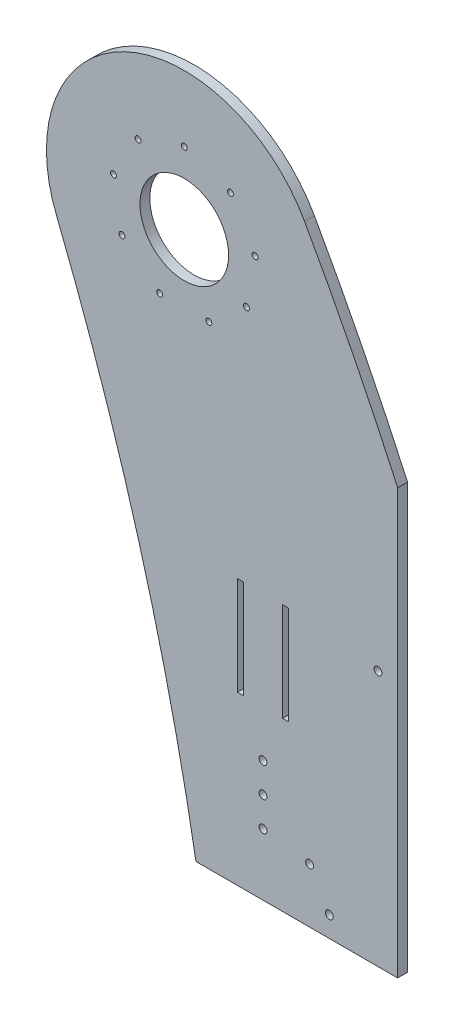
ISO-10303-21;
HEADER;
FILE_DESCRIPTION(('STEP AP214'),'2;1');
FILE_NAME('part.step','',(''),(''),'','','');
FILE_SCHEMA(('AUTOMOTIVE_DESIGN { 1 0 10303 214 1 1 1 1 }'));
ENDSEC;
DATA;
#1=APPLICATION_CONTEXT('core data for automotive mechanical design processes');
#2=APPLICATION_PROTOCOL_DEFINITION('international standard','automotive_design',2000,#1);
#3=PRODUCT_CONTEXT('',#1,'mechanical');
#4=PRODUCT('Part','Part','',(#3));
#5=PRODUCT_RELATED_PRODUCT_CATEGORY('part','',(#4));
#6=PRODUCT_DEFINITION_FORMATION('','',#4);
#7=PRODUCT_DEFINITION_CONTEXT('part definition',#1,'design');
#8=PRODUCT_DEFINITION('design','',#6,#7);
#9=PRODUCT_DEFINITION_SHAPE('','',#8);
#10=(LENGTH_UNIT() NAMED_UNIT(*) SI_UNIT(.MILLI.,.METRE.));
#11=(NAMED_UNIT(*) PLANE_ANGLE_UNIT() SI_UNIT($,.RADIAN.));
#12=(NAMED_UNIT(*) SI_UNIT($,.STERADIAN.) SOLID_ANGLE_UNIT());
#13=UNCERTAINTY_MEASURE_WITH_UNIT(LENGTH_MEASURE(1.E-05),#10,'distance_accuracy_value','');
#14=(GEOMETRIC_REPRESENTATION_CONTEXT(3) GLOBAL_UNCERTAINTY_ASSIGNED_CONTEXT((#13)) GLOBAL_UNIT_ASSIGNED_CONTEXT((#10,
#11,#12)) REPRESENTATION_CONTEXT('',''));
#15=CARTESIAN_POINT('',(0.,0.,0.));
#16=DIRECTION('',(0.,0.,1.));
#17=DIRECTION('',(1.,0.,0.));
#18=AXIS2_PLACEMENT_3D('',#15,#16,#17);
#19=CARTESIAN_POINT('',(0.,325.,0.));
#20=DIRECTION('',(0.,-1.,0.));
#21=DIRECTION('',(0.,0.,-1.));
#22=AXIS2_PLACEMENT_3D('',#19,#20,#21);
#23=PLANE('',#22);
#24=DIRECTION('',(0.,0.,1.));
#25=VECTOR('',#24,1.);
#26=CARTESIAN_POINT('',(-11.5956875587686,324.999999999994,-5.));
#27=LINE('',#26,#25);
#28=CARTESIAN_POINT('',(-11.5956875587686,325.,0.));
#29=VERTEX_POINT('',#28);
#30=CARTESIAN_POINT('',(-11.5956875587686,324.999999999994,5.));
#31=VERTEX_POINT('',#30);
#32=EDGE_CURVE('E55',#29,#31,#27,.T.);
#33=ORIENTED_EDGE('',*,*,#32,.T.);
#34=DIRECTION('',(1.,0.,0.));
#35=VECTOR('',#34,1.);
#36=CARTESIAN_POINT('',(0.,325.,5.));
#37=LINE('',#36,#35);
#38=CARTESIAN_POINT('',(-114.06644065351,325.,5.));
#39=VERTEX_POINT('',#38);
#40=EDGE_CURVE('E278',#39,#31,#37,.T.);
#41=ORIENTED_EDGE('',*,*,#40,.F.);
#42=DIRECTION('',(0.,0.,-1.));
#43=VECTOR('',#42,1.);
#44=CARTESIAN_POINT('',(-114.06644065351,325.,5.));
#45=LINE('',#44,#43);
#46=CARTESIAN_POINT('',(-114.06644065351,325.,0.));
#47=VERTEX_POINT('',#46);
#48=EDGE_CURVE('E282',#47,#39,#45,.F.);
#49=ORIENTED_EDGE('',*,*,#48,.F.);
#50=DIRECTION('',(1.,0.,0.));
#51=VECTOR('',#50,1.);
#52=CARTESIAN_POINT('',(0.,325.,0.));
#53=LINE('',#52,#51);
#54=EDGE_CURVE('E285',#47,#29,#53,.T.);
#55=ORIENTED_EDGE('',*,*,#54,.T.);
#56=EDGE_LOOP('',(#33,#41,#49,#55));
#57=FACE_BOUND('',#56,.T.);
#58=ADVANCED_FACE('F40',(#57),#23,.T.);
#59=CARTESIAN_POINT('',(-1345.24654178278,108.90844860724,5.));
#60=DIRECTION('',(0.,0.,-1.));
#61=DIRECTION('',(-1.,0.,0.));
#62=AXIS2_PLACEMENT_3D('',#59,#60,#61);
#63=CYLINDRICAL_SURFACE('',#62,1250.);
#64=CARTESIAN_POINT('',(-1345.24654178278,108.90844860724,0.));
#65=DIRECTION('',(0.,0.,1.));
#66=DIRECTION('',(1.,0.,0.));
#67=AXIS2_PLACEMENT_3D('',#64,#65,#66);
#68=CIRCLE('',#67,1250.);
#69=CARTESIAN_POINT('',(-184.975195397572,573.95726621402,0.));
#70=VERTEX_POINT('',#69);
#71=EDGE_CURVE('E225',#47,#70,#68,.T.);
#72=ORIENTED_EDGE('',*,*,#71,.F.);
#73=ORIENTED_EDGE('',*,*,#48,.T.);
#74=CARTESIAN_POINT('',(-1345.24654178278,108.90844860724,5.));
#75=DIRECTION('',(0.,0.,1.));
#76=DIRECTION('',(1.,0.,0.));
#77=AXIS2_PLACEMENT_3D('',#74,#75,#76);
#78=CIRCLE('',#77,1250.);
#79=CARTESIAN_POINT('',(-184.975195397572,573.95726621402,5.));
#80=VERTEX_POINT('',#79);
#81=EDGE_CURVE('E290',#39,#80,#78,.T.);
#82=ORIENTED_EDGE('',*,*,#81,.T.);
#83=DIRECTION('',(0.,0.,-1.));
#84=VECTOR('',#83,1.);
#85=CARTESIAN_POINT('',(-184.975195397572,573.95726621402,5.));
#86=LINE('',#85,#84);
#87=EDGE_CURVE('E172',#80,#70,#86,.T.);
#88=ORIENTED_EDGE('',*,*,#87,.T.);
#89=EDGE_LOOP('',(#72,#73,#82,#88));
#90=FACE_BOUND('',#89,.T.);
#91=ADVANCED_FACE('F397',(#90),#63,.F.);
#92=CARTESIAN_POINT('',(-1149.77276852362,23.8333182080057,5.));
#93=DIRECTION('',(0.,0.,-1.));
#94=DIRECTION('',(-1.,0.,0.));
#95=AXIS2_PLACEMENT_3D('',#92,#93,#94);
#96=CYLINDRICAL_SURFACE('',#95,1250.);
#97=CARTESIAN_POINT('',(-1149.77276852362,23.8333182080057,5.));
#98=DIRECTION('',(0.,0.,1.));
#99=DIRECTION('',(1.,0.,0.));
#100=AXIS2_PLACEMENT_3D('',#97,#98,#99);
#101=CIRCLE('',#100,1250.);
#102=CARTESIAN_POINT('',(-11.5956875587686,540.60496252136,5.));
#103=VERTEX_POINT('',#102);
#104=CARTESIAN_POINT('',(-58.9117849180903,634.179379428339,5.));
#105=VERTEX_POINT('',#104);
#106=EDGE_CURVE('E104',#103,#105,#101,.T.);
#107=ORIENTED_EDGE('',*,*,#106,.F.);
#108=DIRECTION('',(0.,0.,1.));
#109=VECTOR('',#108,1.);
#110=CARTESIAN_POINT('',(-11.5956875587686,540.60496252136,-5.));
#111=LINE('',#110,#109);
#112=CARTESIAN_POINT('',(-11.5956875587686,540.60496252136,0.));
#113=VERTEX_POINT('',#112);
#114=EDGE_CURVE('E297',#113,#103,#111,.T.);
#115=ORIENTED_EDGE('',*,*,#114,.F.);
#116=CARTESIAN_POINT('',(-1149.77276852362,23.8333182080057,0.));
#117=DIRECTION('',(0.,0.,1.));
#118=DIRECTION('',(1.,0.,0.));
#119=AXIS2_PLACEMENT_3D('',#116,#117,#118);
#120=CIRCLE('',#119,1250.);
#121=CARTESIAN_POINT('',(-58.9117849180903,634.179379428339,0.));
#122=VERTEX_POINT('',#121);
#123=EDGE_CURVE('E63',#113,#122,#120,.T.);
#124=ORIENTED_EDGE('',*,*,#123,.T.);
#125=DIRECTION('',(0.,0.,-1.));
#126=VECTOR('',#125,1.);
#127=CARTESIAN_POINT('',(-58.9117849180903,634.179379428339,5.));
#128=LINE('',#127,#126);
#129=EDGE_CURVE('E310',#105,#122,#128,.T.);
#130=ORIENTED_EDGE('',*,*,#129,.F.);
#131=EDGE_LOOP('',(#107,#115,#124,#130));
#132=FACE_BOUND('',#131,.T.);
#133=ADVANCED_FACE('F349',(#132),#96,.T.);
#134=CARTESIAN_POINT('',(0.,0.,5.));
#135=DIRECTION('',(0.,0.,1.));
#136=DIRECTION('',(1.,0.,0.));
#137=AXIS2_PLACEMENT_3D('',#134,#135,#136);
#138=PLANE('',#137);
#139=DIRECTION('',(0.,-1.,0.));
#140=VECTOR('',#139,1.);
#141=CARTESIAN_POINT('',(-11.5956875587686,324.999999999994,5.));
#142=LINE('',#141,#140);
#143=EDGE_CURVE('E303',#103,#31,#142,.T.);
#144=ORIENTED_EDGE('',*,*,#143,.F.);
#145=ORIENTED_EDGE('',*,*,#106,.T.);
#146=CARTESIAN_POINT('',(-120.,600.,5.));
#147=DIRECTION('',(0.,0.,1.));
#148=DIRECTION('',(1.,0.,0.));
#149=AXIS2_PLACEMENT_3D('',#146,#147,#148);
#150=CIRCLE('',#149,70.);
#151=EDGE_CURVE('E192',#105,#80,#150,.T.);
#152=ORIENTED_EDGE('',*,*,#151,.T.);
#153=ORIENTED_EDGE('',*,*,#81,.F.);
#154=ORIENTED_EDGE('',*,*,#40,.T.);
#155=EDGE_LOOP('',(#144,#145,#152,#153,#154));
#156=FACE_BOUND('',#155,.T.);
#157=CARTESIAN_POINT('',(-21.5956875587686,455.,5.));
#158=DIRECTION('',(0.,0.,1.));
#159=DIRECTION('',(1.,0.,0.));
#160=AXIS2_PLACEMENT_3D('',#157,#158,#159);
#161=CIRCLE('',#160,2.);
#162=CARTESIAN_POINT('',(-19.5956875587686,455.,5.));
#163=VERTEX_POINT('',#162);
#164=EDGE_CURVE('E307',#163,#163,#161,.T.);
#165=ORIENTED_EDGE('',*,*,#164,.F.);
#166=EDGE_LOOP('',(#165));
#167=FACE_BOUND('',#166,.T.);
#168=CARTESIAN_POINT('',(-120.,600.,5.));
#169=DIRECTION('',(0.,0.,1.));
#170=DIRECTION('',(1.,0.,0.));
#171=AXIS2_PLACEMENT_3D('',#168,#169,#170);
#172=CIRCLE('',#171,22.5);
#173=CARTESIAN_POINT('',(-97.5,600.,5.));
#174=VERTEX_POINT('',#173);
#175=EDGE_CURVE('E168',#174,#174,#172,.T.);
#176=ORIENTED_EDGE('',*,*,#175,.F.);
#177=EDGE_LOOP('',(#176));
#178=FACE_BOUND('',#177,.T.);
#179=DIRECTION('',(1.,0.,0.));
#180=VECTOR('',#179,1.);
#181=CARTESIAN_POINT('',(0.,460.,5.));
#182=LINE('',#181,#180);
#183=CARTESIAN_POINT('',(-70.0000000000001,460.,5.));
#184=VERTEX_POINT('',#183);
#185=CARTESIAN_POINT('',(-67.0000000000001,460.,5.));
#186=VERTEX_POINT('',#185);
#187=EDGE_CURVE('E180',#184,#186,#182,.T.);
#188=ORIENTED_EDGE('',*,*,#187,.T.);
#189=DIRECTION('',(0.,-1.,0.));
#190=VECTOR('',#189,1.);
#191=CARTESIAN_POINT('',(-67.0000000000001,0.,5.));
#192=LINE('',#191,#190);
#193=CARTESIAN_POINT('',(-67.0000000000001,410.,5.));
#194=VERTEX_POINT('',#193);
#195=EDGE_CURVE('E178',#186,#194,#192,.T.);
#196=ORIENTED_EDGE('',*,*,#195,.T.);
#197=DIRECTION('',(1.,0.,0.));
#198=VECTOR('',#197,1.);
#199=CARTESIAN_POINT('',(0.,410.,5.));
#200=LINE('',#199,#198);
#201=CARTESIAN_POINT('',(-70.0000000000001,410.,5.));
#202=VERTEX_POINT('',#201);
#203=EDGE_CURVE('E175',#202,#194,#200,.T.);
#204=ORIENTED_EDGE('',*,*,#203,.F.);
#205=DIRECTION('',(0.,-1.,0.));
#206=VECTOR('',#205,1.);
#207=CARTESIAN_POINT('',(-70.0000000000001,0.,5.));
#208=LINE('',#207,#206);
#209=EDGE_CURVE('E171',#184,#202,#208,.T.);
#210=ORIENTED_EDGE('',*,*,#209,.F.);
#211=EDGE_LOOP('',(#188,#196,#204,#210));
#212=FACE_BOUND('',#211,.T.);
#213=DIRECTION('',(1.,0.,0.));
#214=VECTOR('',#213,1.);
#215=CARTESIAN_POINT('',(0.,460.,5.));
#216=LINE('',#215,#214);
#217=CARTESIAN_POINT('',(-93.0000000000001,460.,5.));
#218=VERTEX_POINT('',#217);
#219=CARTESIAN_POINT('',(-90.0000000000001,460.,5.));
#220=VERTEX_POINT('',#219);
#221=EDGE_CURVE('E190',#218,#220,#216,.T.);
#222=ORIENTED_EDGE('',*,*,#221,.T.);
#223=DIRECTION('',(0.,-1.,0.));
#224=VECTOR('',#223,1.);
#225=CARTESIAN_POINT('',(-90.0000000000001,0.,5.));
#226=LINE('',#225,#224);
#227=CARTESIAN_POINT('',(-90.0000000000001,410.,5.));
#228=VERTEX_POINT('',#227);
#229=EDGE_CURVE('E154',#220,#228,#226,.T.);
#230=ORIENTED_EDGE('',*,*,#229,.T.);
#231=DIRECTION('',(1.,0.,0.));
#232=VECTOR('',#231,1.);
#233=CARTESIAN_POINT('',(0.,410.,5.));
#234=LINE('',#233,#232);
#235=CARTESIAN_POINT('',(-93.0000000000001,410.,5.));
#236=VERTEX_POINT('',#235);
#237=EDGE_CURVE('E186',#236,#228,#234,.T.);
#238=ORIENTED_EDGE('',*,*,#237,.F.);
#239=DIRECTION('',(0.,-1.,0.));
#240=VECTOR('',#239,1.);
#241=CARTESIAN_POINT('',(-93.0000000000001,0.,5.));
#242=LINE('',#241,#240);
#243=EDGE_CURVE('E183',#218,#236,#242,.T.);
#244=ORIENTED_EDGE('',*,*,#243,.F.);
#245=EDGE_LOOP('',(#222,#230,#238,#244));
#246=FACE_BOUND('',#245,.T.);
#247=CARTESIAN_POINT('',(-80.,371.410161513777,5.));
#248=DIRECTION('',(0.,0.,-1.));
#249=DIRECTION('',(-1.,0.,0.));
#250=AXIS2_PLACEMENT_3D('',#247,#248,#249);
#251=CIRCLE('',#250,2.);
#252=CARTESIAN_POINT('',(-82.,371.410161513777,5.));
#253=VERTEX_POINT('',#252);
#254=EDGE_CURVE('E213',#253,#253,#251,.T.);
#255=ORIENTED_EDGE('',*,*,#254,.T.);
#256=EDGE_LOOP('',(#255));
#257=FACE_BOUND('',#256,.T.);
#258=CARTESIAN_POINT('',(-80.0000000000001,356.410161513777,5.));
#259=DIRECTION('',(0.,0.,-1.));
#260=DIRECTION('',(-1.,0.,0.));
#261=AXIS2_PLACEMENT_3D('',#258,#259,#260);
#262=CIRCLE('',#261,2.);
#263=CARTESIAN_POINT('',(-82.0000000000001,356.410161513777,5.));
#264=VERTEX_POINT('',#263);
#265=EDGE_CURVE('E207',#264,#264,#262,.T.);
#266=ORIENTED_EDGE('',*,*,#265,.T.);
#267=EDGE_LOOP('',(#266));
#268=FACE_BOUND('',#267,.T.);
#269=CARTESIAN_POINT('',(-56.3397459621557,352.749907475932,5.));
#270=DIRECTION('',(0.,0.,-1.));
#271=DIRECTION('',(-1.,0.,0.));
#272=AXIS2_PLACEMENT_3D('',#269,#270,#271);
#273=CIRCLE('',#272,1.99999999999999);
#274=CARTESIAN_POINT('',(-58.3397459621557,352.749907475932,5.));
#275=VERTEX_POINT('',#274);
#276=EDGE_CURVE('E201',#275,#275,#273,.T.);
#277=ORIENTED_EDGE('',*,*,#276,.T.);
#278=EDGE_LOOP('',(#277));
#279=FACE_BOUND('',#278,.T.);
#280=CARTESIAN_POINT('',(-46.3397459621558,335.429399400244,5.));
#281=DIRECTION('',(0.,0.,-1.));
#282=DIRECTION('',(-1.,0.,0.));
#283=AXIS2_PLACEMENT_3D('',#280,#281,#282);
#284=CIRCLE('',#283,2.);
#285=CARTESIAN_POINT('',(-48.3397459621558,335.429399400244,5.));
#286=VERTEX_POINT('',#285);
#287=EDGE_CURVE('E194',#286,#286,#284,.T.);
#288=ORIENTED_EDGE('',*,*,#287,.T.);
#289=EDGE_LOOP('',(#288));
#290=FACE_BOUND('',#289,.T.);
#291=CARTESIAN_POINT('',(-79.9999999999999,386.410161513777,5.));
#292=DIRECTION('',(0.,0.,-1.));
#293=DIRECTION('',(-1.,0.,0.));
#294=AXIS2_PLACEMENT_3D('',#291,#292,#293);
#295=CIRCLE('',#294,2.);
#296=CARTESIAN_POINT('',(-81.9999999999999,386.410161513777,5.));
#297=VERTEX_POINT('',#296);
#298=EDGE_CURVE('E222',#297,#297,#295,.T.);
#299=ORIENTED_EDGE('',*,*,#298,.T.);
#300=EDGE_LOOP('',(#299));
#301=FACE_BOUND('',#300,.T.);
#302=CARTESIAN_POINT('',(-143.461747753559,627.960622173843,5.));
#303=DIRECTION('',(0.,0.,1.));
#304=DIRECTION('',(1.,0.,0.));
#305=AXIS2_PLACEMENT_3D('',#302,#303,#304);
#306=CIRCLE('',#305,1.50000000000005);
#307=CARTESIAN_POINT('',(-141.961747753559,627.960622173843,5.));
#308=VERTEX_POINT('',#307);
#309=EDGE_CURVE('E228',#308,#308,#306,.T.);
#310=ORIENTED_EDGE('',*,*,#309,.F.);
#311=EDGE_LOOP('',(#310));
#312=FACE_BOUND('',#311,.T.);
#313=CARTESIAN_POINT('',(-155.945482984946,606.338158484843,5.));
#314=DIRECTION('',(0.,0.,1.));
#315=DIRECTION('',(1.,0.,0.));
#316=AXIS2_PLACEMENT_3D('',#313,#314,#315);
#317=CIRCLE('',#316,1.50000000000002);
#318=CARTESIAN_POINT('',(-154.445482984946,606.338158484843,5.));
#319=VERTEX_POINT('',#318);
#320=EDGE_CURVE('E234',#319,#319,#317,.T.);
#321=ORIENTED_EDGE('',*,*,#320,.F.);
#322=EDGE_LOOP('',(#321));
#323=FACE_BOUND('',#322,.T.);
#324=CARTESIAN_POINT('',(-151.609927238132,581.75,5.));
#325=DIRECTION('',(0.,0.,1.));
#326=DIRECTION('',(1.,0.,0.));
#327=AXIS2_PLACEMENT_3D('',#324,#325,#326);
#328=CIRCLE('',#327,1.5000000000001);
#329=CARTESIAN_POINT('',(-150.109927238132,581.75,5.));
#330=VERTEX_POINT('',#329);
#331=EDGE_CURVE('E240',#330,#330,#328,.T.);
#332=ORIENTED_EDGE('',*,*,#331,.F.);
#333=EDGE_LOOP('',(#332));
#334=FACE_BOUND('',#333,.T.);
#335=CARTESIAN_POINT('',(-132.483735231387,565.701219341314,5.));
#336=DIRECTION('',(0.,0.,1.));
#337=DIRECTION('',(1.,0.,0.));
#338=AXIS2_PLACEMENT_3D('',#335,#336,#337);
#339=CIRCLE('',#338,1.5000000000001);
#340=CARTESIAN_POINT('',(-130.983735231387,565.701219341314,5.));
#341=VERTEX_POINT('',#340);
#342=EDGE_CURVE('E246',#341,#341,#339,.T.);
#343=ORIENTED_EDGE('',*,*,#342,.F.);
#344=EDGE_LOOP('',(#343));
#345=FACE_BOUND('',#344,.T.);
#346=CARTESIAN_POINT('',(-107.516264768613,565.701219341314,5.));
#347=DIRECTION('',(0.,0.,1.));
#348=DIRECTION('',(1.,0.,0.));
#349=AXIS2_PLACEMENT_3D('',#346,#347,#348);
#350=CIRCLE('',#349,1.50000000000006);
#351=CARTESIAN_POINT('',(-106.016264768613,565.701219341314,5.));
#352=VERTEX_POINT('',#351);
#353=EDGE_CURVE('E252',#352,#352,#350,.T.);
#354=ORIENTED_EDGE('',*,*,#353,.F.);
#355=EDGE_LOOP('',(#354));
#356=FACE_BOUND('',#355,.T.);
#357=CARTESIAN_POINT('',(-88.3900727618681,581.75,5.));
#358=DIRECTION('',(0.,0.,1.));
#359=DIRECTION('',(1.,0.,0.));
#360=AXIS2_PLACEMENT_3D('',#357,#358,#359);
#361=CIRCLE('',#360,1.49999999999997);
#362=CARTESIAN_POINT('',(-86.8900727618681,581.75,5.));
#363=VERTEX_POINT('',#362);
#364=EDGE_CURVE('E258',#363,#363,#361,.T.);
#365=ORIENTED_EDGE('',*,*,#364,.F.);
#366=EDGE_LOOP('',(#365));
#367=FACE_BOUND('',#366,.T.);
#368=CARTESIAN_POINT('',(-84.0545170150545,606.338158484843,5.));
#369=DIRECTION('',(0.,0.,1.));
#370=DIRECTION('',(1.,0.,0.));
#371=AXIS2_PLACEMENT_3D('',#368,#369,#370);
#372=CIRCLE('',#371,1.49999999999996);
#373=CARTESIAN_POINT('',(-82.5545170150545,606.338158484843,5.));
#374=VERTEX_POINT('',#373);
#375=EDGE_CURVE('E264',#374,#374,#372,.T.);
#376=ORIENTED_EDGE('',*,*,#375,.F.);
#377=EDGE_LOOP('',(#376));
#378=FACE_BOUND('',#377,.T.);
#379=CARTESIAN_POINT('',(-96.5382522464414,627.960622173843,5.));
#380=DIRECTION('',(0.,0.,1.));
#381=DIRECTION('',(1.,0.,0.));
#382=AXIS2_PLACEMENT_3D('',#379,#380,#381);
#383=CIRCLE('',#382,1.5);
#384=CARTESIAN_POINT('',(-95.0382522464414,627.960622173843,5.));
#385=VERTEX_POINT('',#384);
#386=EDGE_CURVE('E270',#385,#385,#383,.T.);
#387=ORIENTED_EDGE('',*,*,#386,.F.);
#388=EDGE_LOOP('',(#387));
#389=FACE_BOUND('',#388,.T.);
#390=CARTESIAN_POINT('',(-120.,636.5,5.));
#391=DIRECTION('',(0.,0.,1.));
#392=DIRECTION('',(1.,0.,0.));
#393=AXIS2_PLACEMENT_3D('',#390,#391,#392);
#394=CIRCLE('',#393,1.50000000000005);
#395=CARTESIAN_POINT('',(-118.5,636.5,5.));
#396=VERTEX_POINT('',#395);
#397=EDGE_CURVE('E273',#396,#396,#394,.T.);
#398=ORIENTED_EDGE('',*,*,#397,.F.);
#399=EDGE_LOOP('',(#398));
#400=FACE_BOUND('',#399,.T.);
#401=ADVANCED_FACE('F42',(#156,#167,#178,#212,#246,#257,#268,#279,#290,#301,#312,#323,#334,#345,
#356,#367,#378,#389,#400),#138,.T.);
#402=CARTESIAN_POINT('',(0.,0.,0.));
#403=DIRECTION('',(0.,0.,1.));
#404=DIRECTION('',(1.,0.,0.));
#405=AXIS2_PLACEMENT_3D('',#402,#403,#404);
#406=PLANE('',#405);
#407=CARTESIAN_POINT('',(-21.5956875587686,455.,0.));
#408=DIRECTION('',(0.,0.,1.));
#409=DIRECTION('',(1.,0.,0.));
#410=AXIS2_PLACEMENT_3D('',#407,#408,#409);
#411=CIRCLE('',#410,2.);
#412=CARTESIAN_POINT('',(-19.5956875587686,455.,0.));
#413=VERTEX_POINT('',#412);
#414=EDGE_CURVE('E288',#413,#413,#411,.T.);
#415=ORIENTED_EDGE('',*,*,#414,.T.);
#416=EDGE_LOOP('',(#415));
#417=FACE_BOUND('',#416,.T.);
#418=CARTESIAN_POINT('',(-120.,600.,0.));
#419=DIRECTION('',(0.,0.,1.));
#420=DIRECTION('',(1.,0.,0.));
#421=AXIS2_PLACEMENT_3D('',#418,#419,#420);
#422=CIRCLE('',#421,22.5);
#423=CARTESIAN_POINT('',(-97.5,600.,0.));
#424=VERTEX_POINT('',#423);
#425=EDGE_CURVE('E292',#424,#424,#422,.T.);
#426=ORIENTED_EDGE('',*,*,#425,.T.);
#427=EDGE_LOOP('',(#426));
#428=FACE_BOUND('',#427,.T.);
#429=DIRECTION('',(1.,0.,0.));
#430=VECTOR('',#429,1.);
#431=CARTESIAN_POINT('',(0.,460.,0.));
#432=LINE('',#431,#430);
#433=CARTESIAN_POINT('',(-70.0000000000001,460.,0.));
#434=VERTEX_POINT('',#433);
#435=CARTESIAN_POINT('',(-67.0000000000001,460.,0.));
#436=VERTEX_POINT('',#435);
#437=EDGE_CURVE('E337',#434,#436,#432,.T.);
#438=ORIENTED_EDGE('',*,*,#437,.F.);
#439=DIRECTION('',(0.,-1.,0.));
#440=VECTOR('',#439,1.);
#441=CARTESIAN_POINT('',(-70.0000000000001,0.,0.));
#442=LINE('',#441,#440);
#443=CARTESIAN_POINT('',(-70.0000000000001,410.,0.));
#444=VERTEX_POINT('',#443);
#445=EDGE_CURVE('E328',#434,#444,#442,.T.);
#446=ORIENTED_EDGE('',*,*,#445,.T.);
#447=DIRECTION('',(1.,0.,0.));
#448=VECTOR('',#447,1.);
#449=CARTESIAN_POINT('',(0.,410.,0.));
#450=LINE('',#449,#448);
#451=CARTESIAN_POINT('',(-67.0000000000001,410.,0.));
#452=VERTEX_POINT('',#451);
#453=EDGE_CURVE('E331',#444,#452,#450,.T.);
#454=ORIENTED_EDGE('',*,*,#453,.T.);
#455=DIRECTION('',(0.,-1.,0.));
#456=VECTOR('',#455,1.);
#457=CARTESIAN_POINT('',(-67.0000000000001,0.,0.));
#458=LINE('',#457,#456);
#459=EDGE_CURVE('E334',#436,#452,#458,.T.);
#460=ORIENTED_EDGE('',*,*,#459,.F.);
#461=EDGE_LOOP('',(#438,#446,#454,#460));
#462=FACE_BOUND('',#461,.T.);
#463=DIRECTION('',(1.,0.,0.));
#464=VECTOR('',#463,1.);
#465=CARTESIAN_POINT('',(0.,460.,0.));
#466=LINE('',#465,#464);
#467=CARTESIAN_POINT('',(-93.0000000000001,460.,0.));
#468=VERTEX_POINT('',#467);
#469=CARTESIAN_POINT('',(-90.0000000000001,460.,0.));
#470=VERTEX_POINT('',#469);
#471=EDGE_CURVE('E144',#468,#470,#466,.T.);
#472=ORIENTED_EDGE('',*,*,#471,.F.);
#473=DIRECTION('',(0.,-1.,0.));
#474=VECTOR('',#473,1.);
#475=CARTESIAN_POINT('',(-93.0000000000001,0.,0.));
#476=LINE('',#475,#474);
#477=CARTESIAN_POINT('',(-93.0000000000001,410.,0.));
#478=VERTEX_POINT('',#477);
#479=EDGE_CURVE('E339',#468,#478,#476,.T.);
#480=ORIENTED_EDGE('',*,*,#479,.T.);
#481=DIRECTION('',(1.,0.,0.));
#482=VECTOR('',#481,1.);
#483=CARTESIAN_POINT('',(0.,410.,0.));
#484=LINE('',#483,#482);
#485=CARTESIAN_POINT('',(-90.0000000000001,410.,0.));
#486=VERTEX_POINT('',#485);
#487=EDGE_CURVE('E147',#478,#486,#484,.T.);
#488=ORIENTED_EDGE('',*,*,#487,.T.);
#489=DIRECTION('',(0.,-1.,0.));
#490=VECTOR('',#489,1.);
#491=CARTESIAN_POINT('',(-90.0000000000001,0.,0.));
#492=LINE('',#491,#490);
#493=EDGE_CURVE('E138',#470,#486,#492,.T.);
#494=ORIENTED_EDGE('',*,*,#493,.F.);
#495=EDGE_LOOP('',(#472,#480,#488,#494));
#496=FACE_BOUND('',#495,.T.);
#497=CARTESIAN_POINT('',(-80.,371.410161513777,0.));
#498=DIRECTION('',(0.,0.,-1.));
#499=DIRECTION('',(-1.,0.,0.));
#500=AXIS2_PLACEMENT_3D('',#497,#498,#499);
#501=CIRCLE('',#500,2.);
#502=CARTESIAN_POINT('',(-82.,371.410161513777,0.));
#503=VERTEX_POINT('',#502);
#504=EDGE_CURVE('E216',#503,#503,#501,.T.);
#505=ORIENTED_EDGE('',*,*,#504,.F.);
#506=EDGE_LOOP('',(#505));
#507=FACE_BOUND('',#506,.T.);
#508=CARTESIAN_POINT('',(-80.0000000000001,356.410161513777,0.));
#509=DIRECTION('',(0.,0.,-1.));
#510=DIRECTION('',(-1.,0.,0.));
#511=AXIS2_PLACEMENT_3D('',#508,#509,#510);
#512=CIRCLE('',#511,2.);
#513=CARTESIAN_POINT('',(-82.0000000000001,356.410161513777,0.));
#514=VERTEX_POINT('',#513);
#515=EDGE_CURVE('E210',#514,#514,#512,.T.);
#516=ORIENTED_EDGE('',*,*,#515,.F.);
#517=EDGE_LOOP('',(#516));
#518=FACE_BOUND('',#517,.T.);
#519=CARTESIAN_POINT('',(-56.3397459621557,352.749907475932,0.));
#520=DIRECTION('',(0.,0.,-1.));
#521=DIRECTION('',(-1.,0.,0.));
#522=AXIS2_PLACEMENT_3D('',#519,#520,#521);
#523=CIRCLE('',#522,1.99999999999999);
#524=CARTESIAN_POINT('',(-58.3397459621557,352.749907475932,0.));
#525=VERTEX_POINT('',#524);
#526=EDGE_CURVE('E204',#525,#525,#523,.T.);
#527=ORIENTED_EDGE('',*,*,#526,.F.);
#528=EDGE_LOOP('',(#527));
#529=FACE_BOUND('',#528,.T.);
#530=CARTESIAN_POINT('',(-46.3397459621558,335.429399400244,0.));
#531=DIRECTION('',(0.,0.,-1.));
#532=DIRECTION('',(-1.,0.,0.));
#533=AXIS2_PLACEMENT_3D('',#530,#531,#532);
#534=CIRCLE('',#533,2.);
#535=CARTESIAN_POINT('',(-48.3397459621558,335.429399400244,0.));
#536=VERTEX_POINT('',#535);
#537=EDGE_CURVE('E198',#536,#536,#534,.T.);
#538=ORIENTED_EDGE('',*,*,#537,.F.);
#539=EDGE_LOOP('',(#538));
#540=FACE_BOUND('',#539,.T.);
#541=CARTESIAN_POINT('',(-79.9999999999999,386.410161513777,0.));
#542=DIRECTION('',(0.,0.,-1.));
#543=DIRECTION('',(-1.,0.,0.));
#544=AXIS2_PLACEMENT_3D('',#541,#542,#543);
#545=CIRCLE('',#544,2.);
#546=CARTESIAN_POINT('',(-81.9999999999999,386.410161513777,0.));
#547=VERTEX_POINT('',#546);
#548=EDGE_CURVE('E219',#547,#547,#545,.T.);
#549=ORIENTED_EDGE('',*,*,#548,.F.);
#550=EDGE_LOOP('',(#549));
#551=FACE_BOUND('',#550,.T.);
#552=CARTESIAN_POINT('',(-143.461747753559,627.960622173843,0.));
#553=DIRECTION('',(0.,0.,1.));
#554=DIRECTION('',(1.,0.,0.));
#555=AXIS2_PLACEMENT_3D('',#552,#553,#554);
#556=CIRCLE('',#555,1.50000000000005);
#557=CARTESIAN_POINT('',(-141.961747753559,627.960622173843,0.));
#558=VERTEX_POINT('',#557);
#559=EDGE_CURVE('E48',#558,#558,#556,.T.);
#560=ORIENTED_EDGE('',*,*,#559,.T.);
#561=EDGE_LOOP('',(#560));
#562=FACE_BOUND('',#561,.T.);
#563=CARTESIAN_POINT('',(-155.945482984946,606.338158484843,0.));
#564=DIRECTION('',(0.,0.,1.));
#565=DIRECTION('',(1.,0.,0.));
#566=AXIS2_PLACEMENT_3D('',#563,#564,#565);
#567=CIRCLE('',#566,1.50000000000002);
#568=CARTESIAN_POINT('',(-154.445482984946,606.338158484843,0.));
#569=VERTEX_POINT('',#568);
#570=EDGE_CURVE('E231',#569,#569,#567,.T.);
#571=ORIENTED_EDGE('',*,*,#570,.T.);
#572=EDGE_LOOP('',(#571));
#573=FACE_BOUND('',#572,.T.);
#574=CARTESIAN_POINT('',(-151.609927238132,581.75,0.));
#575=DIRECTION('',(0.,0.,1.));
#576=DIRECTION('',(1.,0.,0.));
#577=AXIS2_PLACEMENT_3D('',#574,#575,#576);
#578=CIRCLE('',#577,1.5000000000001);
#579=CARTESIAN_POINT('',(-150.109927238132,581.75,0.));
#580=VERTEX_POINT('',#579);
#581=EDGE_CURVE('E237',#580,#580,#578,.T.);
#582=ORIENTED_EDGE('',*,*,#581,.T.);
#583=EDGE_LOOP('',(#582));
#584=FACE_BOUND('',#583,.T.);
#585=CARTESIAN_POINT('',(-132.483735231387,565.701219341314,0.));
#586=DIRECTION('',(0.,0.,1.));
#587=DIRECTION('',(1.,0.,0.));
#588=AXIS2_PLACEMENT_3D('',#585,#586,#587);
#589=CIRCLE('',#588,1.5000000000001);
#590=CARTESIAN_POINT('',(-130.983735231387,565.701219341314,0.));
#591=VERTEX_POINT('',#590);
#592=EDGE_CURVE('E243',#591,#591,#589,.T.);
#593=ORIENTED_EDGE('',*,*,#592,.T.);
#594=EDGE_LOOP('',(#593));
#595=FACE_BOUND('',#594,.T.);
#596=CARTESIAN_POINT('',(-107.516264768613,565.701219341314,0.));
#597=DIRECTION('',(0.,0.,1.));
#598=DIRECTION('',(1.,0.,0.));
#599=AXIS2_PLACEMENT_3D('',#596,#597,#598);
#600=CIRCLE('',#599,1.50000000000006);
#601=CARTESIAN_POINT('',(-106.016264768613,565.701219341314,0.));
#602=VERTEX_POINT('',#601);
#603=EDGE_CURVE('E249',#602,#602,#600,.T.);
#604=ORIENTED_EDGE('',*,*,#603,.T.);
#605=EDGE_LOOP('',(#604));
#606=FACE_BOUND('',#605,.T.);
#607=CARTESIAN_POINT('',(-88.3900727618681,581.75,0.));
#608=DIRECTION('',(0.,0.,1.));
#609=DIRECTION('',(1.,0.,0.));
#610=AXIS2_PLACEMENT_3D('',#607,#608,#609);
#611=CIRCLE('',#610,1.49999999999997);
#612=CARTESIAN_POINT('',(-86.8900727618681,581.75,0.));
#613=VERTEX_POINT('',#612);
#614=EDGE_CURVE('E255',#613,#613,#611,.T.);
#615=ORIENTED_EDGE('',*,*,#614,.T.);
#616=EDGE_LOOP('',(#615));
#617=FACE_BOUND('',#616,.T.);
#618=CARTESIAN_POINT('',(-84.0545170150545,606.338158484843,0.));
#619=DIRECTION('',(0.,0.,1.));
#620=DIRECTION('',(1.,0.,0.));
#621=AXIS2_PLACEMENT_3D('',#618,#619,#620);
#622=CIRCLE('',#621,1.49999999999996);
#623=CARTESIAN_POINT('',(-82.5545170150545,606.338158484843,0.));
#624=VERTEX_POINT('',#623);
#625=EDGE_CURVE('E261',#624,#624,#622,.T.);
#626=ORIENTED_EDGE('',*,*,#625,.T.);
#627=EDGE_LOOP('',(#626));
#628=FACE_BOUND('',#627,.T.);
#629=CARTESIAN_POINT('',(-96.5382522464414,627.960622173843,0.));
#630=DIRECTION('',(0.,0.,1.));
#631=DIRECTION('',(1.,0.,0.));
#632=AXIS2_PLACEMENT_3D('',#629,#630,#631);
#633=CIRCLE('',#632,1.5);
#634=CARTESIAN_POINT('',(-95.0382522464414,627.960622173843,0.));
#635=VERTEX_POINT('',#634);
#636=EDGE_CURVE('E267',#635,#635,#633,.T.);
#637=ORIENTED_EDGE('',*,*,#636,.T.);
#638=EDGE_LOOP('',(#637));
#639=FACE_BOUND('',#638,.T.);
#640=CARTESIAN_POINT('',(-120.,636.5,0.));
#641=DIRECTION('',(0.,0.,1.));
#642=DIRECTION('',(1.,0.,0.));
#643=AXIS2_PLACEMENT_3D('',#640,#641,#642);
#644=CIRCLE('',#643,1.50000000000005);
#645=CARTESIAN_POINT('',(-118.5,636.5,0.));
#646=VERTEX_POINT('',#645);
#647=EDGE_CURVE('E197',#646,#646,#644,.T.);
#648=ORIENTED_EDGE('',*,*,#647,.T.);
#649=EDGE_LOOP('',(#648));
#650=FACE_BOUND('',#649,.T.);
#651=ORIENTED_EDGE('',*,*,#123,.F.);
#652=DIRECTION('',(0.,-1.,0.));
#653=VECTOR('',#652,1.);
#654=CARTESIAN_POINT('',(-11.5956875587687,0.,0.));
#655=LINE('',#654,#653);
#656=EDGE_CURVE('E12',#113,#29,#655,.T.);
#657=ORIENTED_EDGE('',*,*,#656,.T.);
#658=ORIENTED_EDGE('',*,*,#54,.F.);
#659=ORIENTED_EDGE('',*,*,#71,.T.);
#660=CARTESIAN_POINT('',(-120.,600.,0.));
#661=DIRECTION('',(0.,0.,1.));
#662=DIRECTION('',(1.,0.,0.));
#663=AXIS2_PLACEMENT_3D('',#660,#661,#662);
#664=CIRCLE('',#663,70.);
#665=EDGE_CURVE('E162',#122,#70,#664,.T.);
#666=ORIENTED_EDGE('',*,*,#665,.F.);
#667=EDGE_LOOP('',(#651,#657,#658,#659,#666));
#668=FACE_BOUND('',#667,.T.);
#669=ADVANCED_FACE('F140',(#417,#428,#462,#496,#507,#518,#529,#540,#551,#562,#573,#584,#595,
#606,#617,#628,#639,#650,#668),#406,.F.);
#670=CARTESIAN_POINT('',(0.,460.,5.));
#671=DIRECTION('',(0.,1.,0.));
#672=DIRECTION('',(0.,0.,1.));
#673=AXIS2_PLACEMENT_3D('',#670,#671,#672);
#674=PLANE('',#673);
#675=ORIENTED_EDGE('',*,*,#437,.T.);
#676=DIRECTION('',(0.,0.,-1.));
#677=VECTOR('',#676,1.);
#678=CARTESIAN_POINT('',(-67.0000000000001,460.,5.));
#679=LINE('',#678,#677);
#680=EDGE_CURVE('E281',#186,#436,#679,.T.);
#681=ORIENTED_EDGE('',*,*,#680,.F.);
#682=ORIENTED_EDGE('',*,*,#187,.F.);
#683=DIRECTION('',(0.,0.,-1.));
#684=VECTOR('',#683,1.);
#685=CARTESIAN_POINT('',(-70.0000000000001,460.,5.));
#686=LINE('',#685,#684);
#687=EDGE_CURVE('E112',#184,#434,#686,.T.);
#688=ORIENTED_EDGE('',*,*,#687,.T.);
#689=EDGE_LOOP('',(#675,#681,#682,#688));
#690=FACE_BOUND('',#689,.T.);
#691=ADVANCED_FACE('F407',(#690),#674,.F.);
#692=CARTESIAN_POINT('',(-67.0000000000001,0.,5.));
#693=DIRECTION('',(1.,0.,0.));
#694=DIRECTION('',(0.,0.,-1.));
#695=AXIS2_PLACEMENT_3D('',#692,#693,#694);
#696=PLANE('',#695);
#697=ORIENTED_EDGE('',*,*,#459,.T.);
#698=DIRECTION('',(0.,0.,-1.));
#699=VECTOR('',#698,1.);
#700=CARTESIAN_POINT('',(-67.0000000000001,410.,5.));
#701=LINE('',#700,#699);
#702=EDGE_CURVE('E321',#194,#452,#701,.T.);
#703=ORIENTED_EDGE('',*,*,#702,.F.);
#704=ORIENTED_EDGE('',*,*,#195,.F.);
#705=ORIENTED_EDGE('',*,*,#680,.T.);
#706=EDGE_LOOP('',(#697,#703,#704,#705));
#707=FACE_BOUND('',#706,.T.);
#708=ADVANCED_FACE('F411',(#707),#696,.F.);
#709=CARTESIAN_POINT('',(0.,410.,5.));
#710=DIRECTION('',(0.,1.,0.));
#711=DIRECTION('',(0.,0.,1.));
#712=AXIS2_PLACEMENT_3D('',#709,#710,#711);
#713=PLANE('',#712);
#714=ORIENTED_EDGE('',*,*,#453,.F.);
#715=DIRECTION('',(0.,0.,-1.));
#716=VECTOR('',#715,1.);
#717=CARTESIAN_POINT('',(-70.0000000000001,410.,5.));
#718=LINE('',#717,#716);
#719=EDGE_CURVE('E323',#202,#444,#718,.T.);
#720=ORIENTED_EDGE('',*,*,#719,.F.);
#721=ORIENTED_EDGE('',*,*,#203,.T.);
#722=ORIENTED_EDGE('',*,*,#702,.T.);
#723=EDGE_LOOP('',(#714,#720,#721,#722));
#724=FACE_BOUND('',#723,.T.);
#725=ADVANCED_FACE('F424',(#724),#713,.T.);
#726=CARTESIAN_POINT('',(0.,460.,5.));
#727=DIRECTION('',(0.,1.,0.));
#728=DIRECTION('',(0.,0.,1.));
#729=AXIS2_PLACEMENT_3D('',#726,#727,#728);
#730=PLANE('',#729);
#731=ORIENTED_EDGE('',*,*,#471,.T.);
#732=DIRECTION('',(0.,0.,-1.));
#733=VECTOR('',#732,1.);
#734=CARTESIAN_POINT('',(-90.0000000000001,460.,5.));
#735=LINE('',#734,#733);
#736=EDGE_CURVE('E152',#220,#470,#735,.T.);
#737=ORIENTED_EDGE('',*,*,#736,.F.);
#738=ORIENTED_EDGE('',*,*,#221,.F.);
#739=DIRECTION('',(0.,0.,-1.));
#740=VECTOR('',#739,1.);
#741=CARTESIAN_POINT('',(-93.0000000000001,460.,5.));
#742=LINE('',#741,#740);
#743=EDGE_CURVE('E161',#218,#468,#742,.T.);
#744=ORIENTED_EDGE('',*,*,#743,.T.);
#745=EDGE_LOOP('',(#731,#737,#738,#744));
#746=FACE_BOUND('',#745,.T.);
#747=ADVANCED_FACE('F160',(#746),#730,.F.);
#748=CARTESIAN_POINT('',(-90.0000000000001,0.,5.));
#749=DIRECTION('',(1.,0.,0.));
#750=DIRECTION('',(0.,0.,-1.));
#751=AXIS2_PLACEMENT_3D('',#748,#749,#750);
#752=PLANE('',#751);
#753=ORIENTED_EDGE('',*,*,#493,.T.);
#754=DIRECTION('',(0.,0.,-1.));
#755=VECTOR('',#754,1.);
#756=CARTESIAN_POINT('',(-90.0000000000001,410.,5.));
#757=LINE('',#756,#755);
#758=EDGE_CURVE('E158',#228,#486,#757,.T.);
#759=ORIENTED_EDGE('',*,*,#758,.F.);
#760=ORIENTED_EDGE('',*,*,#229,.F.);
#761=ORIENTED_EDGE('',*,*,#736,.T.);
#762=EDGE_LOOP('',(#753,#759,#760,#761));
#763=FACE_BOUND('',#762,.T.);
#764=ADVANCED_FACE('F153',(#763),#752,.F.);
#765=CARTESIAN_POINT('',(0.,410.,5.));
#766=DIRECTION('',(0.,1.,0.));
#767=DIRECTION('',(0.,0.,1.));
#768=AXIS2_PLACEMENT_3D('',#765,#766,#767);
#769=PLANE('',#768);
#770=ORIENTED_EDGE('',*,*,#487,.F.);
#771=DIRECTION('',(0.,0.,-1.));
#772=VECTOR('',#771,1.);
#773=CARTESIAN_POINT('',(-93.0000000000001,410.,5.));
#774=LINE('',#773,#772);
#775=EDGE_CURVE('E316',#236,#478,#774,.T.);
#776=ORIENTED_EDGE('',*,*,#775,.F.);
#777=ORIENTED_EDGE('',*,*,#237,.T.);
#778=ORIENTED_EDGE('',*,*,#758,.T.);
#779=EDGE_LOOP('',(#770,#776,#777,#778));
#780=FACE_BOUND('',#779,.T.);
#781=ADVANCED_FACE('F345',(#780),#769,.T.);
#782=CARTESIAN_POINT('',(-70.0000000000001,0.,5.));
#783=DIRECTION('',(1.,0.,0.));
#784=DIRECTION('',(0.,0.,-1.));
#785=AXIS2_PLACEMENT_3D('',#782,#783,#784);
#786=PLANE('',#785);
#787=ORIENTED_EDGE('',*,*,#445,.F.);
#788=ORIENTED_EDGE('',*,*,#687,.F.);
#789=ORIENTED_EDGE('',*,*,#209,.T.);
#790=ORIENTED_EDGE('',*,*,#719,.T.);
#791=EDGE_LOOP('',(#787,#788,#789,#790));
#792=FACE_BOUND('',#791,.T.);
#793=ADVANCED_FACE('F419',(#792),#786,.T.);
#794=CARTESIAN_POINT('',(-93.0000000000001,0.,5.));
#795=DIRECTION('',(1.,0.,0.));
#796=DIRECTION('',(0.,0.,-1.));
#797=AXIS2_PLACEMENT_3D('',#794,#795,#796);
#798=PLANE('',#797);
#799=ORIENTED_EDGE('',*,*,#479,.F.);
#800=ORIENTED_EDGE('',*,*,#743,.F.);
#801=ORIENTED_EDGE('',*,*,#243,.T.);
#802=ORIENTED_EDGE('',*,*,#775,.T.);
#803=EDGE_LOOP('',(#799,#800,#801,#802));
#804=FACE_BOUND('',#803,.T.);
#805=ADVANCED_FACE('F341',(#804),#798,.T.);
#806=CARTESIAN_POINT('',(-120.,600.,5.));
#807=DIRECTION('',(0.,0.,-1.));
#808=DIRECTION('',(-1.,0.,0.));
#809=AXIS2_PLACEMENT_3D('',#806,#807,#808);
#810=CYLINDRICAL_SURFACE('',#809,70.);
#811=ORIENTED_EDGE('',*,*,#665,.T.);
#812=ORIENTED_EDGE('',*,*,#87,.F.);
#813=ORIENTED_EDGE('',*,*,#151,.F.);
#814=ORIENTED_EDGE('',*,*,#129,.T.);
#815=EDGE_LOOP('',(#811,#812,#813,#814));
#816=FACE_BOUND('',#815,.T.);
#817=ADVANCED_FACE('F442',(#816),#810,.T.);
#818=CARTESIAN_POINT('',(-120.,600.,5.));
#819=DIRECTION('',(0.,0.,-1.));
#820=DIRECTION('',(-1.,0.,0.));
#821=AXIS2_PLACEMENT_3D('',#818,#819,#820);
#822=CYLINDRICAL_SURFACE('',#821,22.5);
#823=ORIENTED_EDGE('',*,*,#175,.T.);
#824=EDGE_LOOP('',(#823));
#825=FACE_BOUND('',#824,.T.);
#826=ORIENTED_EDGE('',*,*,#425,.F.);
#827=EDGE_LOOP('',(#826));
#828=FACE_BOUND('',#827,.T.);
#829=ADVANCED_FACE('F438',(#825,#828),#822,.F.);
#830=CARTESIAN_POINT('',(-80.,371.410161513777,5.));
#831=DIRECTION('',(0.,0.,-1.));
#832=DIRECTION('',(-1.,0.,0.));
#833=AXIS2_PLACEMENT_3D('',#830,#831,#832);
#834=CYLINDRICAL_SURFACE('',#833,2.);
#835=ORIENTED_EDGE('',*,*,#254,.F.);
#836=EDGE_LOOP('',(#835));
#837=FACE_BOUND('',#836,.T.);
#838=ORIENTED_EDGE('',*,*,#504,.T.);
#839=EDGE_LOOP('',(#838));
#840=FACE_BOUND('',#839,.T.);
#841=ADVANCED_FACE('F441',(#837,#840),#834,.F.);
#842=CARTESIAN_POINT('',(-80.0000000000001,356.410161513777,5.));
#843=DIRECTION('',(0.,0.,-1.));
#844=DIRECTION('',(-1.,0.,0.));
#845=AXIS2_PLACEMENT_3D('',#842,#843,#844);
#846=CYLINDRICAL_SURFACE('',#845,2.);
#847=ORIENTED_EDGE('',*,*,#265,.F.);
#848=EDGE_LOOP('',(#847));
#849=FACE_BOUND('',#848,.T.);
#850=ORIENTED_EDGE('',*,*,#515,.T.);
#851=EDGE_LOOP('',(#850));
#852=FACE_BOUND('',#851,.T.);
#853=ADVANCED_FACE('F452',(#849,#852),#846,.F.);
#854=CARTESIAN_POINT('',(-56.3397459621557,352.749907475932,5.));
#855=DIRECTION('',(0.,0.,-1.));
#856=DIRECTION('',(-1.,0.,0.));
#857=AXIS2_PLACEMENT_3D('',#854,#855,#856);
#858=CYLINDRICAL_SURFACE('',#857,1.99999999999999);
#859=ORIENTED_EDGE('',*,*,#276,.F.);
#860=EDGE_LOOP('',(#859));
#861=FACE_BOUND('',#860,.T.);
#862=ORIENTED_EDGE('',*,*,#526,.T.);
#863=EDGE_LOOP('',(#862));
#864=FACE_BOUND('',#863,.T.);
#865=ADVANCED_FACE('F448',(#861,#864),#858,.F.);
#866=CARTESIAN_POINT('',(-46.3397459621558,335.429399400244,5.));
#867=DIRECTION('',(0.,0.,-1.));
#868=DIRECTION('',(-1.,0.,0.));
#869=AXIS2_PLACEMENT_3D('',#866,#867,#868);
#870=CYLINDRICAL_SURFACE('',#869,2.);
#871=ORIENTED_EDGE('',*,*,#287,.F.);
#872=EDGE_LOOP('',(#871));
#873=FACE_BOUND('',#872,.T.);
#874=ORIENTED_EDGE('',*,*,#537,.T.);
#875=EDGE_LOOP('',(#874));
#876=FACE_BOUND('',#875,.T.);
#877=ADVANCED_FACE('F444',(#873,#876),#870,.F.);
#878=CARTESIAN_POINT('',(-79.9999999999999,386.410161513777,5.));
#879=DIRECTION('',(0.,0.,-1.));
#880=DIRECTION('',(-1.,0.,0.));
#881=AXIS2_PLACEMENT_3D('',#878,#879,#880);
#882=CYLINDRICAL_SURFACE('',#881,2.);
#883=ORIENTED_EDGE('',*,*,#298,.F.);
#884=EDGE_LOOP('',(#883));
#885=FACE_BOUND('',#884,.T.);
#886=ORIENTED_EDGE('',*,*,#548,.T.);
#887=EDGE_LOOP('',(#886));
#888=FACE_BOUND('',#887,.T.);
#889=ADVANCED_FACE('F447',(#885,#888),#882,.F.);
#890=CARTESIAN_POINT('',(-143.461747753559,627.960622173843,0.));
#891=DIRECTION('',(0.,0.,1.));
#892=DIRECTION('',(1.,0.,0.));
#893=AXIS2_PLACEMENT_3D('',#890,#891,#892);
#894=CYLINDRICAL_SURFACE('',#893,1.50000000000005);
#895=ORIENTED_EDGE('',*,*,#559,.F.);
#896=EDGE_LOOP('',(#895));
#897=FACE_BOUND('',#896,.T.);
#898=ORIENTED_EDGE('',*,*,#309,.T.);
#899=EDGE_LOOP('',(#898));
#900=FACE_BOUND('',#899,.T.);
#901=ADVANCED_FACE('F462',(#897,#900),#894,.F.);
#902=CARTESIAN_POINT('',(-155.945482984946,606.338158484843,0.));
#903=DIRECTION('',(0.,0.,1.));
#904=DIRECTION('',(1.,0.,0.));
#905=AXIS2_PLACEMENT_3D('',#902,#903,#904);
#906=CYLINDRICAL_SURFACE('',#905,1.50000000000002);
#907=ORIENTED_EDGE('',*,*,#570,.F.);
#908=EDGE_LOOP('',(#907));
#909=FACE_BOUND('',#908,.T.);
#910=ORIENTED_EDGE('',*,*,#320,.T.);
#911=EDGE_LOOP('',(#910));
#912=FACE_BOUND('',#911,.T.);
#913=ADVANCED_FACE('F466',(#909,#912),#906,.F.);
#914=CARTESIAN_POINT('',(-151.609927238132,581.75,0.));
#915=DIRECTION('',(0.,0.,1.));
#916=DIRECTION('',(1.,0.,0.));
#917=AXIS2_PLACEMENT_3D('',#914,#915,#916);
#918=CYLINDRICAL_SURFACE('',#917,1.5000000000001);
#919=ORIENTED_EDGE('',*,*,#581,.F.);
#920=EDGE_LOOP('',(#919));
#921=FACE_BOUND('',#920,.T.);
#922=ORIENTED_EDGE('',*,*,#331,.T.);
#923=EDGE_LOOP('',(#922));
#924=FACE_BOUND('',#923,.T.);
#925=ADVANCED_FACE('F470',(#921,#924),#918,.F.);
#926=CARTESIAN_POINT('',(-132.483735231387,565.701219341314,0.));
#927=DIRECTION('',(0.,0.,1.));
#928=DIRECTION('',(1.,0.,0.));
#929=AXIS2_PLACEMENT_3D('',#926,#927,#928);
#930=CYLINDRICAL_SURFACE('',#929,1.5000000000001);
#931=ORIENTED_EDGE('',*,*,#592,.F.);
#932=EDGE_LOOP('',(#931));
#933=FACE_BOUND('',#932,.T.);
#934=ORIENTED_EDGE('',*,*,#342,.T.);
#935=EDGE_LOOP('',(#934));
#936=FACE_BOUND('',#935,.T.);
#937=ADVANCED_FACE('F474',(#933,#936),#930,.F.);
#938=CARTESIAN_POINT('',(-107.516264768613,565.701219341314,0.));
#939=DIRECTION('',(0.,0.,1.));
#940=DIRECTION('',(1.,0.,0.));
#941=AXIS2_PLACEMENT_3D('',#938,#939,#940);
#942=CYLINDRICAL_SURFACE('',#941,1.50000000000006);
#943=ORIENTED_EDGE('',*,*,#603,.F.);
#944=EDGE_LOOP('',(#943));
#945=FACE_BOUND('',#944,.T.);
#946=ORIENTED_EDGE('',*,*,#353,.T.);
#947=EDGE_LOOP('',(#946));
#948=FACE_BOUND('',#947,.T.);
#949=ADVANCED_FACE('F478',(#945,#948),#942,.F.);
#950=CARTESIAN_POINT('',(-88.3900727618681,581.75,0.));
#951=DIRECTION('',(0.,0.,1.));
#952=DIRECTION('',(1.,0.,0.));
#953=AXIS2_PLACEMENT_3D('',#950,#951,#952);
#954=CYLINDRICAL_SURFACE('',#953,1.49999999999997);
#955=ORIENTED_EDGE('',*,*,#614,.F.);
#956=EDGE_LOOP('',(#955));
#957=FACE_BOUND('',#956,.T.);
#958=ORIENTED_EDGE('',*,*,#364,.T.);
#959=EDGE_LOOP('',(#958));
#960=FACE_BOUND('',#959,.T.);
#961=ADVANCED_FACE('F482',(#957,#960),#954,.F.);
#962=CARTESIAN_POINT('',(-84.0545170150545,606.338158484843,0.));
#963=DIRECTION('',(0.,0.,1.));
#964=DIRECTION('',(1.,0.,0.));
#965=AXIS2_PLACEMENT_3D('',#962,#963,#964);
#966=CYLINDRICAL_SURFACE('',#965,1.49999999999996);
#967=ORIENTED_EDGE('',*,*,#625,.F.);
#968=EDGE_LOOP('',(#967));
#969=FACE_BOUND('',#968,.T.);
#970=ORIENTED_EDGE('',*,*,#375,.T.);
#971=EDGE_LOOP('',(#970));
#972=FACE_BOUND('',#971,.T.);
#973=ADVANCED_FACE('F391',(#969,#972),#966,.F.);
#974=CARTESIAN_POINT('',(-96.5382522464414,627.960622173843,0.));
#975=DIRECTION('',(0.,0.,1.));
#976=DIRECTION('',(1.,0.,0.));
#977=AXIS2_PLACEMENT_3D('',#974,#975,#976);
#978=CYLINDRICAL_SURFACE('',#977,1.5);
#979=ORIENTED_EDGE('',*,*,#636,.F.);
#980=EDGE_LOOP('',(#979));
#981=FACE_BOUND('',#980,.T.);
#982=ORIENTED_EDGE('',*,*,#386,.T.);
#983=EDGE_LOOP('',(#982));
#984=FACE_BOUND('',#983,.T.);
#985=ADVANCED_FACE('F381',(#981,#984),#978,.F.);
#986=CARTESIAN_POINT('',(-120.,636.5,0.));
#987=DIRECTION('',(0.,0.,1.));
#988=DIRECTION('',(1.,0.,0.));
#989=AXIS2_PLACEMENT_3D('',#986,#987,#988);
#990=CYLINDRICAL_SURFACE('',#989,1.50000000000005);
#991=ORIENTED_EDGE('',*,*,#647,.F.);
#992=EDGE_LOOP('',(#991));
#993=FACE_BOUND('',#992,.T.);
#994=ORIENTED_EDGE('',*,*,#397,.T.);
#995=EDGE_LOOP('',(#994));
#996=FACE_BOUND('',#995,.T.);
#997=ADVANCED_FACE('F378',(#993,#996),#990,.F.);
#998=CARTESIAN_POINT('',(-21.5956875587686,455.,-5.));
#999=DIRECTION('',(0.,0.,1.));
#1000=DIRECTION('',(1.,0.,0.));
#1001=AXIS2_PLACEMENT_3D('',#998,#999,#1000);
#1002=CYLINDRICAL_SURFACE('',#1001,2.);
#1003=ORIENTED_EDGE('',*,*,#164,.T.);
#1004=EDGE_LOOP('',(#1003));
#1005=FACE_BOUND('',#1004,.T.);
#1006=ORIENTED_EDGE('',*,*,#414,.F.);
#1007=EDGE_LOOP('',(#1006));
#1008=FACE_BOUND('',#1007,.T.);
#1009=ADVANCED_FACE('F380',(#1005,#1008),#1002,.F.);
#1010=CARTESIAN_POINT('',(-11.5956875587686,324.999999999994,-5.));
#1011=DIRECTION('',(-1.,0.,0.));
#1012=DIRECTION('',(0.,-1.,0.));
#1013=AXIS2_PLACEMENT_3D('',#1010,#1011,#1012);
#1014=PLANE('',#1013);
#1015=ORIENTED_EDGE('',*,*,#114,.T.);
#1016=ORIENTED_EDGE('',*,*,#143,.T.);
#1017=ORIENTED_EDGE('',*,*,#32,.F.);
#1018=ORIENTED_EDGE('',*,*,#656,.F.);
#1019=EDGE_LOOP('',(#1015,#1016,#1017,#1018));
#1020=FACE_BOUND('',#1019,.T.);
#1021=ADVANCED_FACE('F388',(#1020),#1014,.F.);
#1022=CLOSED_SHELL('',(#58,#91,#133,#401,#669,#691,#708,#725,#747,#764,#781,#793,#805,#817,#829,
#841,#853,#865,#877,#889,#901,#913,#925,#937,#949,#961,#973,#985,#997,#1009,#1021));
#1023=MANIFOLD_SOLID_BREP('B2',#1022);
#1024=ADVANCED_BREP_SHAPE_REPRESENTATION('',(#18,#1023),#14);
#1025=SHAPE_DEFINITION_REPRESENTATION(#9,#1024);
ENDSEC;
END-ISO-10303-21;
